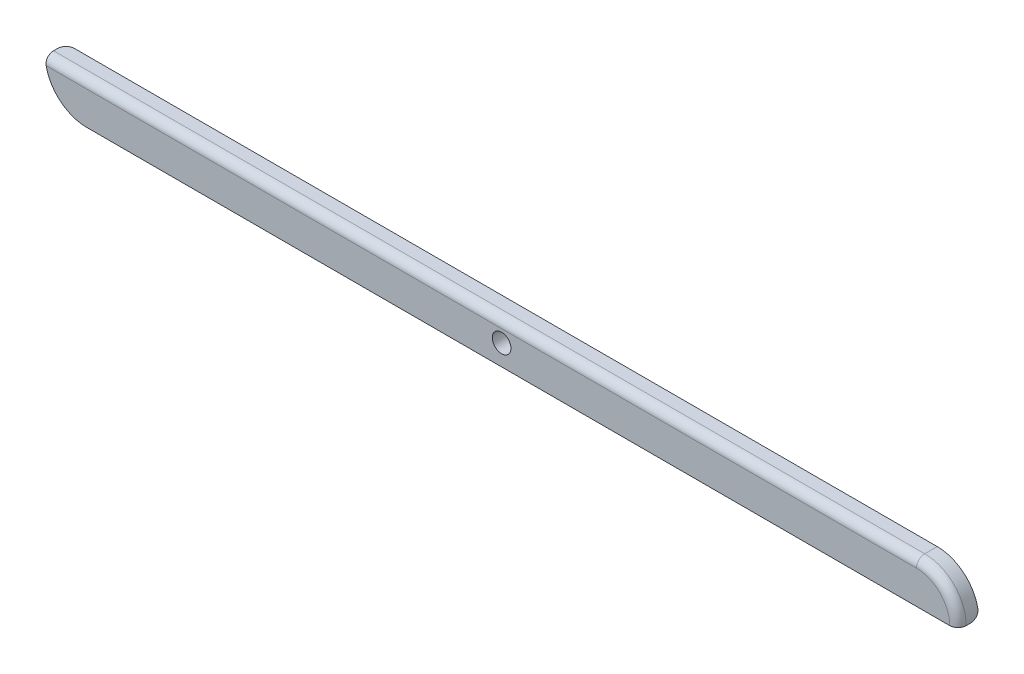
ISO-10303-21;
HEADER;
FILE_DESCRIPTION(('STEP AP214'),'2;1');
FILE_NAME('part.step','',(''),(''),'','','');
FILE_SCHEMA(('AUTOMOTIVE_DESIGN { 1 0 10303 214 1 1 1 1 }'));
ENDSEC;
DATA;
#1=APPLICATION_CONTEXT('core data for automotive mechanical design processes');
#2=APPLICATION_PROTOCOL_DEFINITION('international standard','automotive_design',2000,#1);
#3=PRODUCT_CONTEXT('',#1,'mechanical');
#4=PRODUCT('Part','Part','',(#3));
#5=PRODUCT_RELATED_PRODUCT_CATEGORY('part','',(#4));
#6=PRODUCT_DEFINITION_FORMATION('','',#4);
#7=PRODUCT_DEFINITION_CONTEXT('part definition',#1,'design');
#8=PRODUCT_DEFINITION('design','',#6,#7);
#9=PRODUCT_DEFINITION_SHAPE('','',#8);
#10=(LENGTH_UNIT() NAMED_UNIT(*) SI_UNIT(.MILLI.,.METRE.));
#11=(NAMED_UNIT(*) PLANE_ANGLE_UNIT() SI_UNIT($,.RADIAN.));
#12=(NAMED_UNIT(*) SI_UNIT($,.STERADIAN.) SOLID_ANGLE_UNIT());
#13=UNCERTAINTY_MEASURE_WITH_UNIT(LENGTH_MEASURE(1.E-05),#10,'distance_accuracy_value','');
#14=(GEOMETRIC_REPRESENTATION_CONTEXT(3) GLOBAL_UNCERTAINTY_ASSIGNED_CONTEXT((#13)) GLOBAL_UNIT_ASSIGNED_CONTEXT((#10,
#11,#12)) REPRESENTATION_CONTEXT('',''));
#15=CARTESIAN_POINT('',(0.,0.,0.));
#16=DIRECTION('',(0.,0.,1.));
#17=DIRECTION('',(1.,0.,0.));
#18=AXIS2_PLACEMENT_3D('',#15,#16,#17);
#19=CARTESIAN_POINT('',(0.,0.,175.));
#20=DIRECTION('',(0.,0.,1.));
#21=DIRECTION('',(1.,0.,0.));
#22=AXIS2_PLACEMENT_3D('',#19,#20,#21);
#23=PLANE('',#22);
#24=CARTESIAN_POINT('',(300.,195.,175.));
#25=DIRECTION('',(0.,0.,1.));
#26=DIRECTION('',(1.,0.,0.));
#27=AXIS2_PLACEMENT_3D('',#24,#25,#26);
#28=CIRCLE('',#27,8.);
#29=CARTESIAN_POINT('',(308.,195.,175.));
#30=VERTEX_POINT('',#29);
#31=CARTESIAN_POINT('',(300.,203.,175.));
#32=VERTEX_POINT('',#31);
#33=EDGE_CURVE('E160',#30,#32,#28,.T.);
#34=ORIENTED_EDGE('',*,*,#33,.T.);
#35=DIRECTION('',(-1.,0.,0.));
#36=VECTOR('',#35,1.);
#37=CARTESIAN_POINT('',(89.9999999999998,203.,175.));
#38=LINE('',#37,#36);
#39=CARTESIAN_POINT('',(90.202041028867,203.,175.));
#40=VERTEX_POINT('',#39);
#41=EDGE_CURVE('E163',#32,#40,#38,.T.);
#42=ORIENTED_EDGE('',*,*,#41,.T.);
#43=CARTESIAN_POINT('',(99.9999999999998,205.,175.));
#44=DIRECTION('',(0.,0.,1.));
#45=DIRECTION('',(1.,0.,0.));
#46=AXIS2_PLACEMENT_3D('',#43,#44,#45);
#47=CIRCLE('',#46,10.);
#48=CARTESIAN_POINT('',(99.9999999999998,195.,175.));
#49=VERTEX_POINT('',#48);
#50=EDGE_CURVE('E157',#40,#49,#47,.T.);
#51=ORIENTED_EDGE('',*,*,#50,.T.);
#52=DIRECTION('',(1.,0.,0.));
#53=VECTOR('',#52,1.);
#54=CARTESIAN_POINT('',(89.9999999999998,195.,175.));
#55=LINE('',#54,#53);
#56=EDGE_CURVE('E138',#49,#30,#55,.T.);
#57=ORIENTED_EDGE('',*,*,#56,.T.);
#58=EDGE_LOOP('',(#34,#42,#51,#57));
#59=FACE_BOUND('',#58,.T.);
#60=CARTESIAN_POINT('',(200.,200.,175.));
#61=DIRECTION('',(0.,0.,1.));
#62=DIRECTION('',(1.,0.,0.));
#63=AXIS2_PLACEMENT_3D('',#60,#61,#62);
#64=CIRCLE('',#63,2.25000000000001);
#65=CARTESIAN_POINT('',(202.25,200.,175.));
#66=VERTEX_POINT('',#65);
#67=EDGE_CURVE('E139',#66,#66,#64,.T.);
#68=ORIENTED_EDGE('',*,*,#67,.F.);
#69=EDGE_LOOP('',(#68));
#70=FACE_BOUND('',#69,.T.);
#71=ADVANCED_FACE('F47',(#59,#70),#23,.T.);
#72=CARTESIAN_POINT('',(0.,0.,170.));
#73=DIRECTION('',(0.,0.,1.));
#74=DIRECTION('',(1.,0.,0.));
#75=AXIS2_PLACEMENT_3D('',#72,#73,#74);
#76=PLANE('',#75);
#77=DIRECTION('',(1.,0.,0.));
#78=VECTOR('',#77,1.);
#79=CARTESIAN_POINT('',(0.,197.,170.));
#80=LINE('',#79,#78);
#81=CARTESIAN_POINT('',(309.797958971133,197.,170.));
#82=VERTEX_POINT('',#81);
#83=CARTESIAN_POINT('',(99.9999999999998,197.,170.));
#84=VERTEX_POINT('',#83);
#85=EDGE_CURVE('E228',#82,#84,#80,.F.);
#86=ORIENTED_EDGE('',*,*,#85,.T.);
#87=CARTESIAN_POINT('',(99.9999999999998,205.,170.));
#88=DIRECTION('',(0.,0.,1.));
#89=DIRECTION('',(1.,0.,0.));
#90=AXIS2_PLACEMENT_3D('',#87,#88,#89);
#91=CIRCLE('',#90,8.);
#92=CARTESIAN_POINT('',(91.9999999999997,205.,170.));
#93=VERTEX_POINT('',#92);
#94=EDGE_CURVE('E136',#84,#93,#91,.F.);
#95=ORIENTED_EDGE('',*,*,#94,.T.);
#96=DIRECTION('',(-1.,0.,0.));
#97=VECTOR('',#96,1.);
#98=CARTESIAN_POINT('',(89.9999999999998,205.,170.));
#99=LINE('',#98,#97);
#100=CARTESIAN_POINT('',(300.,205.,170.));
#101=VERTEX_POINT('',#100);
#102=EDGE_CURVE('E114',#101,#93,#99,.T.);
#103=ORIENTED_EDGE('',*,*,#102,.F.);
#104=CARTESIAN_POINT('',(300.,195.,170.));
#105=DIRECTION('',(0.,0.,1.));
#106=DIRECTION('',(1.,0.,0.));
#107=AXIS2_PLACEMENT_3D('',#104,#105,#106);
#108=CIRCLE('',#107,10.);
#109=EDGE_CURVE('E121',#101,#82,#108,.F.);
#110=ORIENTED_EDGE('',*,*,#109,.T.);
#111=EDGE_LOOP('',(#86,#95,#103,#110));
#112=FACE_BOUND('',#111,.T.);
#113=CARTESIAN_POINT('',(200.,200.,170.));
#114=DIRECTION('',(0.,0.,1.));
#115=DIRECTION('',(1.,0.,0.));
#116=AXIS2_PLACEMENT_3D('',#113,#114,#115);
#117=CIRCLE('',#116,2.25000000000001);
#118=CARTESIAN_POINT('',(202.25,200.,170.));
#119=VERTEX_POINT('',#118);
#120=EDGE_CURVE('E147',#119,#119,#117,.T.);
#121=ORIENTED_EDGE('',*,*,#120,.T.);
#122=EDGE_LOOP('',(#121));
#123=FACE_BOUND('',#122,.T.);
#124=ADVANCED_FACE('F133',(#112,#123),#76,.F.);
#125=CARTESIAN_POINT('',(89.9999999999998,205.,175.));
#126=DIRECTION('',(0.,-1.,0.));
#127=DIRECTION('',(0.,0.,-1.));
#128=AXIS2_PLACEMENT_3D('',#125,#126,#127);
#129=PLANE('',#128);
#130=ORIENTED_EDGE('',*,*,#102,.T.);
#131=CARTESIAN_POINT('',(91.9999999999997,205.,172.));
#132=DIRECTION('',(0.,-1.,0.));
#133=DIRECTION('',(0.,0.,-1.));
#134=AXIS2_PLACEMENT_3D('',#131,#132,#133);
#135=CIRCLE('',#134,2.);
#136=CARTESIAN_POINT('',(89.9999999999998,205.,172.));
#137=VERTEX_POINT('',#136);
#138=EDGE_CURVE('E223',#93,#137,#135,.F.);
#139=ORIENTED_EDGE('',*,*,#138,.T.);
#140=DIRECTION('',(0.,0.,-1.));
#141=VECTOR('',#140,1.);
#142=CARTESIAN_POINT('',(89.9999999999998,205.,175.));
#143=LINE('',#142,#141);
#144=CARTESIAN_POINT('',(89.9999999999998,205.,173.));
#145=VERTEX_POINT('',#144);
#146=EDGE_CURVE('E122',#145,#137,#143,.T.);
#147=ORIENTED_EDGE('',*,*,#146,.F.);
#148=DIRECTION('',(-1.,0.,0.));
#149=VECTOR('',#148,1.);
#150=CARTESIAN_POINT('',(300.,205.,173.));
#151=LINE('',#150,#149);
#152=CARTESIAN_POINT('',(300.,205.,173.));
#153=VERTEX_POINT('',#152);
#154=EDGE_CURVE('E117',#145,#153,#151,.F.);
#155=ORIENTED_EDGE('',*,*,#154,.T.);
#156=DIRECTION('',(0.,0.,-1.));
#157=VECTOR('',#156,1.);
#158=CARTESIAN_POINT('',(300.,205.,175.));
#159=LINE('',#158,#157);
#160=EDGE_CURVE('E110',#153,#101,#159,.T.);
#161=ORIENTED_EDGE('',*,*,#160,.T.);
#162=EDGE_LOOP('',(#130,#139,#147,#155,#161));
#163=FACE_BOUND('',#162,.T.);
#164=ADVANCED_FACE('F112',(#163),#129,.F.);
#165=CARTESIAN_POINT('',(89.9999999999998,195.,175.));
#166=DIRECTION('',(0.,1.,0.));
#167=DIRECTION('',(0.,0.,1.));
#168=AXIS2_PLACEMENT_3D('',#165,#166,#167);
#169=PLANE('',#168);
#170=DIRECTION('',(0.,0.,-1.));
#171=VECTOR('',#170,1.);
#172=CARTESIAN_POINT('',(99.9999999999998,195.,175.));
#173=LINE('',#172,#171);
#174=CARTESIAN_POINT('',(99.9999999999998,195.,172.));
#175=VERTEX_POINT('',#174);
#176=EDGE_CURVE('E130',#49,#175,#173,.T.);
#177=ORIENTED_EDGE('',*,*,#176,.T.);
#178=DIRECTION('',(1.,0.,0.));
#179=VECTOR('',#178,1.);
#180=CARTESIAN_POINT('',(89.9999999999998,195.,172.));
#181=LINE('',#180,#179);
#182=CARTESIAN_POINT('',(310.,195.,172.));
#183=VERTEX_POINT('',#182);
#184=EDGE_CURVE('E58',#175,#183,#181,.T.);
#185=ORIENTED_EDGE('',*,*,#184,.T.);
#186=DIRECTION('',(0.,0.,-1.));
#187=VECTOR('',#186,1.);
#188=CARTESIAN_POINT('',(310.,195.,175.));
#189=LINE('',#188,#187);
#190=CARTESIAN_POINT('',(310.,195.,173.));
#191=VERTEX_POINT('',#190);
#192=EDGE_CURVE('E144',#191,#183,#189,.T.);
#193=ORIENTED_EDGE('',*,*,#192,.F.);
#194=CARTESIAN_POINT('',(308.,195.,173.));
#195=DIRECTION('',(0.,1.,0.));
#196=DIRECTION('',(0.,0.,1.));
#197=AXIS2_PLACEMENT_3D('',#194,#195,#196);
#198=CIRCLE('',#197,2.);
#199=EDGE_CURVE('E231',#191,#30,#198,.F.);
#200=ORIENTED_EDGE('',*,*,#199,.T.);
#201=ORIENTED_EDGE('',*,*,#56,.F.);
#202=EDGE_LOOP('',(#177,#185,#193,#200,#201));
#203=FACE_BOUND('',#202,.T.);
#204=ADVANCED_FACE('F208',(#203),#169,.F.);
#205=CARTESIAN_POINT('',(200.,200.,175.));
#206=DIRECTION('',(0.,0.,-1.));
#207=DIRECTION('',(-1.,0.,0.));
#208=AXIS2_PLACEMENT_3D('',#205,#206,#207);
#209=CYLINDRICAL_SURFACE('',#208,2.25000000000001);
#210=ORIENTED_EDGE('',*,*,#67,.T.);
#211=EDGE_LOOP('',(#210));
#212=FACE_BOUND('',#211,.T.);
#213=ORIENTED_EDGE('',*,*,#120,.F.);
#214=EDGE_LOOP('',(#213));
#215=FACE_BOUND('',#214,.T.);
#216=ADVANCED_FACE('F206',(#212,#215),#209,.F.);
#217=CARTESIAN_POINT('',(300.,195.,175.));
#218=DIRECTION('',(0.,0.,-1.));
#219=DIRECTION('',(-1.,0.,0.));
#220=AXIS2_PLACEMENT_3D('',#217,#218,#219);
#221=CYLINDRICAL_SURFACE('',#220,10.);
#222=ORIENTED_EDGE('',*,*,#192,.T.);
#223=CARTESIAN_POINT('',(310.,195.,172.));
#224=CARTESIAN_POINT('',(309.999997268344,195.000000377039,171.943752766753));
#225=CARTESIAN_POINT('',(310.000000307189,195.002374301775,171.887532473924));
#226=CARTESIAN_POINT('',(309.999994638326,195.01184488433,171.775493783355));
#227=CARTESIAN_POINT('',(309.999985931161,195.018941323569,171.719675367136));
#228=CARTESIAN_POINT('',(309.999907347434,195.047248362317,171.553512249747));
#229=CARTESIAN_POINT('',(309.999785146962,195.075476860724,171.44427980561));
#230=CARTESIAN_POINT('',(309.998945332333,195.14986554526,171.232103909857));
#231=CARTESIAN_POINT('',(309.998227419113,195.196034731839,171.129163644935));
#232=CARTESIAN_POINT('',(309.995496109383,195.304983700939,170.932505115195));
#233=CARTESIAN_POINT('',(309.993482933443,195.367760654242,170.838785283356));
#234=CARTESIAN_POINT('',(309.987334258811,195.507992960709,170.663398760228));
#235=CARTESIAN_POINT('',(309.983202327858,195.585423501069,170.58171210317));
#236=CARTESIAN_POINT('',(309.971979236616,195.752757625712,170.432535012556));
#237=CARTESIAN_POINT('',(309.96488799101,195.842661569554,170.365044988375));
#238=CARTESIAN_POINT('',(309.947099913797,196.031568464858,170.2465774404));
#239=CARTESIAN_POINT('',(309.93642793674,196.130505361752,170.195490715841));
#240=CARTESIAN_POINT('',(309.911019450611,196.335023438876,170.110541478823));
#241=CARTESIAN_POINT('',(309.896284208779,196.440602539644,170.076673605545));
#242=CARTESIAN_POINT('',(309.867816246382,196.622309479067,170.034497279077));
#243=CARTESIAN_POINT('',(309.855156243263,196.69756454047,170.021539052406));
#244=CARTESIAN_POINT('',(309.827950867554,196.848601596621,170.004289989158));
#245=CARTESIAN_POINT('',(309.813408502957,196.924382571939,169.999985501636));
#246=CARTESIAN_POINT('',(309.797958971133,197.,170.));
#247=B_SPLINE_CURVE_WITH_KNOTS('',3,(#223,#224,#225,#226,#227,#228,#229,#230,#231,#232,#233,
#234,#235,#236,#237,#238,#239,#240,#241,#242,#243,#244,#245,#246),.UNSPECIFIED.,.F.,.F.,(4,2,2,
2,2,2,2,2,2,2,2,4),(0.,0.168638105248174,0.337268405634304,0.673996246708664,1.01089323527807,
1.34773286862538,1.68400715637155,2.02029113960704,2.35428760468359,2.68818002144569,
2.91991219621427,3.15127853454384),.UNSPECIFIED.);
#248=EDGE_CURVE('E12',#183,#82,#247,.T.);
#249=ORIENTED_EDGE('',*,*,#248,.T.);
#250=ORIENTED_EDGE('',*,*,#109,.F.);
#251=ORIENTED_EDGE('',*,*,#160,.F.);
#252=CARTESIAN_POINT('',(300.,195.,173.));
#253=DIRECTION('',(0.,0.,1.));
#254=DIRECTION('',(1.,0.,0.));
#255=AXIS2_PLACEMENT_3D('',#252,#253,#254);
#256=CIRCLE('',#255,10.);
#257=EDGE_CURVE('E237',#153,#191,#256,.F.);
#258=ORIENTED_EDGE('',*,*,#257,.T.);
#259=EDGE_LOOP('',(#222,#249,#250,#251,#258));
#260=FACE_BOUND('',#259,.T.);
#261=ADVANCED_FACE('F125',(#260),#221,.T.);
#262=CARTESIAN_POINT('',(99.9999999999998,205.,175.));
#263=DIRECTION('',(0.,0.,-1.));
#264=DIRECTION('',(-1.,0.,0.));
#265=AXIS2_PLACEMENT_3D('',#262,#263,#264);
#266=CYLINDRICAL_SURFACE('',#265,10.);
#267=ORIENTED_EDGE('',*,*,#146,.T.);
#268=CARTESIAN_POINT('',(99.9999999999998,205.,172.));
#269=DIRECTION('',(0.,0.,1.));
#270=DIRECTION('',(1.,0.,0.));
#271=AXIS2_PLACEMENT_3D('',#268,#269,#270);
#272=CIRCLE('',#271,10.);
#273=EDGE_CURVE('E72',#137,#175,#272,.T.);
#274=ORIENTED_EDGE('',*,*,#273,.T.);
#275=ORIENTED_EDGE('',*,*,#176,.F.);
#276=ORIENTED_EDGE('',*,*,#50,.F.);
#277=CARTESIAN_POINT('',(90.202041028867,203.,175.));
#278=CARTESIAN_POINT('',(90.1908061177782,203.05502736492,174.999999653392));
#279=CARTESIAN_POINT('',(90.1800449052061,203.110127321646,174.997727307437));
#280=CARTESIAN_POINT('',(90.1595114837245,203.220137399742,174.988615027905));
#281=CARTESIAN_POINT('',(90.1497393534775,203.275047505679,174.981774731362));
#282=CARTESIAN_POINT('',(90.1219971270683,203.438826423316,174.954392284707));
#283=CARTESIAN_POINT('',(90.1055699492222,203.546897617357,174.926988688377));
#284=CARTESIAN_POINT('',(90.0769141041708,203.757539029262,174.854339793128));
#285=CARTESIAN_POINT('',(90.064690098945,203.860103033111,174.809074801807));
#286=CARTESIAN_POINT('',(90.0441198552835,204.056496246607,174.701857725121));
#287=CARTESIAN_POINT('',(90.0357721376466,204.150328777258,174.63991201944));
#288=CARTESIAN_POINT('',(90.0223886411809,204.325516079107,174.501774388562));
#289=CARTESIAN_POINT('',(90.0173195135715,204.406989824196,174.425736371635));
#290=CARTESIAN_POINT('',(90.0095697088989,204.556262434779,174.261108627546));
#291=CARTESIAN_POINT('',(90.0068896841629,204.624057561519,174.172515479945));
#292=CARTESIAN_POINT('',(90.0030878072718,204.744277728105,173.984871288402));
#293=CARTESIAN_POINT('',(90.0019729838757,204.796632606274,173.885775205655));
#294=CARTESIAN_POINT('',(90.0005759870979,204.884067640728,173.680253435144));
#295=CARTESIAN_POINT('',(90.0002934071335,204.919156225277,173.573831352426));
#296=CARTESIAN_POINT('',(90.0000503209987,204.963349222265,173.389107392094));
#297=CARTESIAN_POINT('',(90.0000189180386,204.977081341205,173.311879395343));
#298=CARTESIAN_POINT('',(89.9999999987654,204.995408149844,173.156444448434));
#299=CARTESIAN_POINT('',(90.0000124279665,205.000014172659,173.078238833989));
#300=CARTESIAN_POINT('',(89.9999999999998,205.,173.));
#301=B_SPLINE_CURVE_WITH_KNOTS('',3,(#277,#278,#279,#280,#281,#282,#283,#284,#285,#286,#287,
#288,#289,#290,#291,#292,#293,#294,#295,#296,#297,#298,#299,#300),.UNSPECIFIED.,.F.,.F.,(4,2,2,
2,2,2,2,2,2,2,2,4),(0.,0.168390823389393,0.336795028538616,0.673138573401849,1.00985398178615,
1.34644079290083,1.67954774299103,2.0127456176982,2.34743503044954,2.68196090748717,
2.91676970044808,3.15128671611927),.UNSPECIFIED.);
#302=EDGE_CURVE('E167',#40,#145,#301,.T.);
#303=ORIENTED_EDGE('',*,*,#302,.T.);
#304=EDGE_LOOP('',(#267,#274,#275,#276,#303));
#305=FACE_BOUND('',#304,.T.);
#306=ADVANCED_FACE('F177',(#305),#266,.T.);
#307=CARTESIAN_POINT('',(300.,195.,173.));
#308=DIRECTION('',(0.,0.,1.));
#309=DIRECTION('',(1.,0.,0.));
#310=AXIS2_PLACEMENT_3D('',#307,#308,#309);
#311=TOROIDAL_SURFACE('',#310,8.,2.);
#312=ORIENTED_EDGE('',*,*,#199,.F.);
#313=ORIENTED_EDGE('',*,*,#257,.F.);
#314=CARTESIAN_POINT('',(300.,203.,173.));
#315=DIRECTION('',(-1.,0.,0.));
#316=DIRECTION('',(0.,0.,1.));
#317=AXIS2_PLACEMENT_3D('',#314,#315,#316);
#318=CIRCLE('',#317,2.);
#319=EDGE_CURVE('E232',#32,#153,#318,.T.);
#320=ORIENTED_EDGE('',*,*,#319,.F.);
#321=ORIENTED_EDGE('',*,*,#33,.F.);
#322=EDGE_LOOP('',(#312,#313,#320,#321));
#323=FACE_BOUND('',#322,.T.);
#324=ADVANCED_FACE('F184',(#323),#311,.T.);
#325=CARTESIAN_POINT('',(0.,203.,173.));
#326=DIRECTION('',(1.,0.,0.));
#327=DIRECTION('',(0.,0.,-1.));
#328=AXIS2_PLACEMENT_3D('',#325,#326,#327);
#329=CYLINDRICAL_SURFACE('',#328,2.);
#330=ORIENTED_EDGE('',*,*,#319,.T.);
#331=ORIENTED_EDGE('',*,*,#154,.F.);
#332=ORIENTED_EDGE('',*,*,#302,.F.);
#333=ORIENTED_EDGE('',*,*,#41,.F.);
#334=EDGE_LOOP('',(#330,#331,#332,#333));
#335=FACE_BOUND('',#334,.T.);
#336=ADVANCED_FACE('F180',(#335),#329,.T.);
#337=CARTESIAN_POINT('',(89.9999999999998,197.,172.));
#338=DIRECTION('',(1.,0.,0.));
#339=DIRECTION('',(0.,0.,-1.));
#340=AXIS2_PLACEMENT_3D('',#337,#338,#339);
#341=CYLINDRICAL_SURFACE('',#340,2.);
#342=ORIENTED_EDGE('',*,*,#248,.F.);
#343=ORIENTED_EDGE('',*,*,#184,.F.);
#344=CARTESIAN_POINT('',(99.9999999999998,197.,172.));
#345=DIRECTION('',(-1.,0.,0.));
#346=DIRECTION('',(0.,0.,1.));
#347=AXIS2_PLACEMENT_3D('',#344,#345,#346);
#348=CIRCLE('',#347,2.);
#349=EDGE_CURVE('E52',#84,#175,#348,.T.);
#350=ORIENTED_EDGE('',*,*,#349,.F.);
#351=ORIENTED_EDGE('',*,*,#85,.F.);
#352=EDGE_LOOP('',(#342,#343,#350,#351));
#353=FACE_BOUND('',#352,.T.);
#354=ADVANCED_FACE('F49',(#353),#341,.T.);
#355=CARTESIAN_POINT('',(99.9999999999998,205.,172.));
#356=DIRECTION('',(0.,0.,1.));
#357=DIRECTION('',(1.,0.,0.));
#358=AXIS2_PLACEMENT_3D('',#355,#356,#357);
#359=TOROIDAL_SURFACE('',#358,8.,2.);
#360=ORIENTED_EDGE('',*,*,#349,.T.);
#361=ORIENTED_EDGE('',*,*,#273,.F.);
#362=ORIENTED_EDGE('',*,*,#138,.F.);
#363=ORIENTED_EDGE('',*,*,#94,.F.);
#364=EDGE_LOOP('',(#360,#361,#362,#363));
#365=FACE_BOUND('',#364,.T.);
#366=ADVANCED_FACE('F188',(#365),#359,.T.);
#367=CLOSED_SHELL('',(#71,#124,#164,#204,#216,#261,#306,#324,#336,#354,#366));
#368=MANIFOLD_SOLID_BREP('B2',#367);
#369=ADVANCED_BREP_SHAPE_REPRESENTATION('',(#18,#368),#14);
#370=SHAPE_DEFINITION_REPRESENTATION(#9,#369);
ENDSEC;
END-ISO-10303-21;
